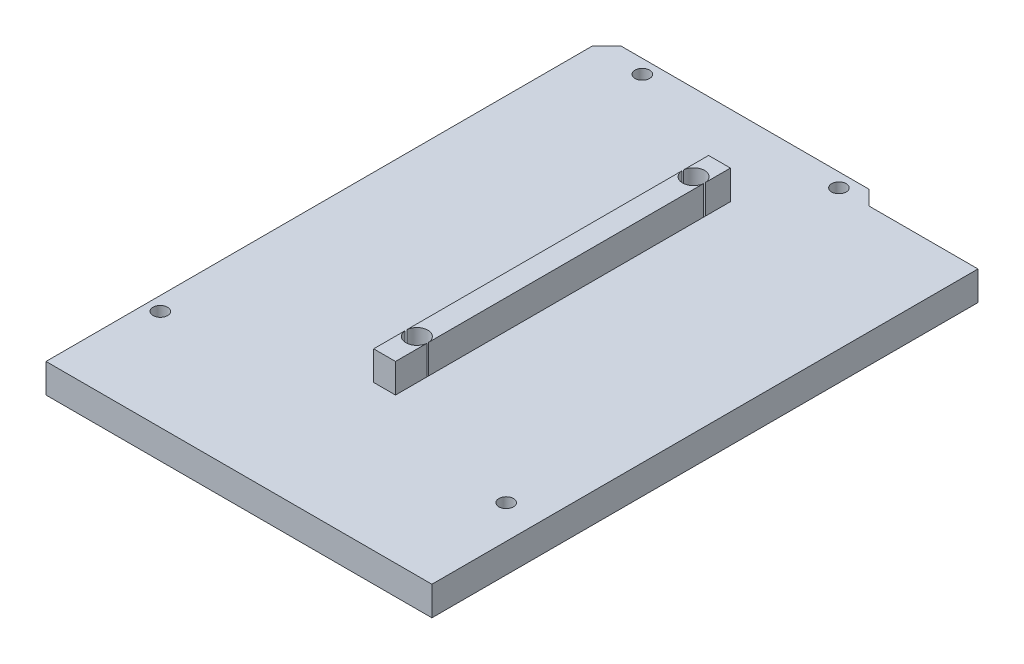
ISO-10303-21;
HEADER;
FILE_DESCRIPTION(('STEP AP214'),'2;1');
FILE_NAME('part.step','',(''),(''),'','','');
FILE_SCHEMA(('AUTOMOTIVE_DESIGN { 1 0 10303 214 1 1 1 1 }'));
ENDSEC;
DATA;
#1=APPLICATION_CONTEXT('core data for automotive mechanical design processes');
#2=APPLICATION_PROTOCOL_DEFINITION('international standard','automotive_design',2000,#1);
#3=PRODUCT_CONTEXT('',#1,'mechanical');
#4=PRODUCT('Part','Part','',(#3));
#5=PRODUCT_RELATED_PRODUCT_CATEGORY('part','',(#4));
#6=PRODUCT_DEFINITION_FORMATION('','',#4);
#7=PRODUCT_DEFINITION_CONTEXT('part definition',#1,'design');
#8=PRODUCT_DEFINITION('design','',#6,#7);
#9=PRODUCT_DEFINITION_SHAPE('','',#8);
#10=(LENGTH_UNIT() NAMED_UNIT(*) SI_UNIT(.MILLI.,.METRE.));
#11=(NAMED_UNIT(*) PLANE_ANGLE_UNIT() SI_UNIT($,.RADIAN.));
#12=(NAMED_UNIT(*) SI_UNIT($,.STERADIAN.) SOLID_ANGLE_UNIT());
#13=UNCERTAINTY_MEASURE_WITH_UNIT(LENGTH_MEASURE(1.E-05),#10,'distance_accuracy_value','');
#14=(GEOMETRIC_REPRESENTATION_CONTEXT(3) GLOBAL_UNCERTAINTY_ASSIGNED_CONTEXT((#13)) GLOBAL_UNIT_ASSIGNED_CONTEXT((#10,
#11,#12)) REPRESENTATION_CONTEXT('',''));
#15=CARTESIAN_POINT('',(0.,0.,0.));
#16=DIRECTION('',(0.,0.,1.));
#17=DIRECTION('',(1.,0.,0.));
#18=AXIS2_PLACEMENT_3D('',#15,#16,#17);
#19=CARTESIAN_POINT('',(25.3962608511216,8.,-65.8241962346628));
#20=DIRECTION('',(1.,0.,0.));
#21=DIRECTION('',(0.,0.,-1.));
#22=AXIS2_PLACEMENT_3D('',#19,#20,#21);
#23=PLANE('',#22);
#24=DIRECTION('',(0.,0.,1.));
#25=VECTOR('',#24,1.);
#26=CARTESIAN_POINT('',(25.3962608511216,8.,-65.8241962346628));
#27=LINE('',#26,#25);
#28=CARTESIAN_POINT('',(25.3962608511216,8.,-24.1403998808304));
#29=VERTEX_POINT('',#28);
#30=CARTESIAN_POINT('',(25.3962608511216,8.,-19.8241962346628));
#31=VERTEX_POINT('',#30);
#32=EDGE_CURVE('E261',#29,#31,#27,.T.);
#33=ORIENTED_EDGE('',*,*,#32,.F.);
#34=DIRECTION('',(0.,-1.,0.));
#35=VECTOR('',#34,1.);
#36=CARTESIAN_POINT('',(25.3962608511216,8.,-24.1403998808304));
#37=LINE('',#36,#35);
#38=CARTESIAN_POINT('',(25.3962608511216,4.,-24.1403998808304));
#39=VERTEX_POINT('',#38);
#40=EDGE_CURVE('E51',#29,#39,#37,.T.);
#41=ORIENTED_EDGE('',*,*,#40,.T.);
#42=DIRECTION('',(0.,0.,1.));
#43=VECTOR('',#42,1.);
#44=CARTESIAN_POINT('',(25.3962608511216,4.,-65.8241962346628));
#45=LINE('',#44,#43);
#46=CARTESIAN_POINT('',(25.3962608511216,4.,-19.8241962346628));
#47=VERTEX_POINT('',#46);
#48=EDGE_CURVE('E308',#39,#47,#45,.T.);
#49=ORIENTED_EDGE('',*,*,#48,.T.);
#50=DIRECTION('',(0.,-1.,0.));
#51=VECTOR('',#50,1.);
#52=CARTESIAN_POINT('',(25.3962608511216,8.,-19.8241962346628));
#53=LINE('',#52,#51);
#54=EDGE_CURVE('E392',#31,#47,#53,.T.);
#55=ORIENTED_EDGE('',*,*,#54,.F.);
#56=EDGE_LOOP('',(#33,#41,#49,#55));
#57=FACE_BOUND('',#56,.T.);
#58=ADVANCED_FACE('F35',(#57),#23,.F.);
#59=CARTESIAN_POINT('',(25.3962608511216,4.,-62.1403998808306));
#60=VERTEX_POINT('',#59);
#61=CARTESIAN_POINT('',(25.3962608511216,4.,-24.3855528942731));
#62=VERTEX_POINT('',#61);
#63=EDGE_CURVE('E275',#60,#62,#45,.T.);
#64=ORIENTED_EDGE('',*,*,#63,.T.);
#65=DIRECTION('',(0.,-1.,0.));
#66=VECTOR('',#65,1.);
#67=CARTESIAN_POINT('',(25.3962608511216,8.,-24.3855528942731));
#68=LINE('',#67,#66);
#69=CARTESIAN_POINT('',(25.3962608511216,8.,-24.3855528942731));
#70=VERTEX_POINT('',#69);
#71=EDGE_CURVE('E237',#62,#70,#68,.F.);
#72=ORIENTED_EDGE('',*,*,#71,.T.);
#73=CARTESIAN_POINT('',(25.3962608511216,8.,-62.1403998808306));
#74=VERTEX_POINT('',#73);
#75=EDGE_CURVE('E251',#74,#70,#27,.T.);
#76=ORIENTED_EDGE('',*,*,#75,.F.);
#77=DIRECTION('',(0.,-1.,0.));
#78=VECTOR('',#77,1.);
#79=CARTESIAN_POINT('',(25.3962608511216,8.,-62.1403998808306));
#80=LINE('',#79,#78);
#81=EDGE_CURVE('E59',#74,#60,#80,.T.);
#82=ORIENTED_EDGE('',*,*,#81,.T.);
#83=EDGE_LOOP('',(#64,#72,#76,#82));
#84=FACE_BOUND('',#83,.T.);
#85=ADVANCED_FACE('F360',(#84),#23,.F.);
#86=CARTESIAN_POINT('',(28.3962608511216,8.,-65.8241962346628));
#87=DIRECTION('',(-1.,0.,0.));
#88=DIRECTION('',(0.,0.,1.));
#89=AXIS2_PLACEMENT_3D('',#86,#87,#88);
#90=PLANE('',#89);
#91=DIRECTION('',(0.,0.,-1.));
#92=VECTOR('',#91,1.);
#93=CARTESIAN_POINT('',(28.3962608511216,8.,-65.8241962346628));
#94=LINE('',#93,#92);
#95=CARTESIAN_POINT('',(28.3962608511216,8.,-24.385552894273));
#96=VERTEX_POINT('',#95);
#97=CARTESIAN_POINT('',(28.3962608511216,8.,-62.1403998808304));
#98=VERTEX_POINT('',#97);
#99=EDGE_CURVE('E192',#96,#98,#94,.T.);
#100=ORIENTED_EDGE('',*,*,#99,.F.);
#101=DIRECTION('',(0.,-1.,0.));
#102=VECTOR('',#101,1.);
#103=CARTESIAN_POINT('',(28.3962608511216,8.,-24.385552894273));
#104=LINE('',#103,#102);
#105=CARTESIAN_POINT('',(28.3962608511216,4.,-24.385552894273));
#106=VERTEX_POINT('',#105);
#107=EDGE_CURVE('E234',#96,#106,#104,.T.);
#108=ORIENTED_EDGE('',*,*,#107,.T.);
#109=DIRECTION('',(0.,0.,-1.));
#110=VECTOR('',#109,1.);
#111=CARTESIAN_POINT('',(28.3962608511216,4.,-65.8241962346628));
#112=LINE('',#111,#110);
#113=CARTESIAN_POINT('',(28.3962608511216,4.,-62.1403998808303));
#114=VERTEX_POINT('',#113);
#115=EDGE_CURVE('E325',#106,#114,#112,.T.);
#116=ORIENTED_EDGE('',*,*,#115,.T.);
#117=DIRECTION('',(0.,-1.,0.));
#118=VECTOR('',#117,1.);
#119=CARTESIAN_POINT('',(28.3962608511216,8.,-62.1403998808303));
#120=LINE('',#119,#118);
#121=EDGE_CURVE('E231',#114,#98,#120,.F.);
#122=ORIENTED_EDGE('',*,*,#121,.T.);
#123=EDGE_LOOP('',(#100,#108,#116,#122));
#124=FACE_BOUND('',#123,.T.);
#125=ADVANCED_FACE('F330',(#124),#90,.F.);
#126=CARTESIAN_POINT('',(28.3962608511216,8.,-62.3855528942732));
#127=VERTEX_POINT('',#126);
#128=CARTESIAN_POINT('',(28.3962608511216,8.,-65.8241962346628));
#129=VERTEX_POINT('',#128);
#130=EDGE_CURVE('E181',#127,#129,#94,.T.);
#131=ORIENTED_EDGE('',*,*,#130,.F.);
#132=DIRECTION('',(0.,-1.,0.));
#133=VECTOR('',#132,1.);
#134=CARTESIAN_POINT('',(28.3962608511216,8.,-62.3855528942732));
#135=LINE('',#134,#133);
#136=CARTESIAN_POINT('',(28.3962608511216,4.,-62.3855528942732));
#137=VERTEX_POINT('',#136);
#138=EDGE_CURVE('E165',#127,#137,#135,.T.);
#139=ORIENTED_EDGE('',*,*,#138,.T.);
#140=CARTESIAN_POINT('',(28.3962608511216,4.,-65.8241962346628));
#141=VERTEX_POINT('',#140);
#142=EDGE_CURVE('E327',#137,#141,#112,.T.);
#143=ORIENTED_EDGE('',*,*,#142,.T.);
#144=DIRECTION('',(0.,-1.,0.));
#145=VECTOR('',#144,1.);
#146=CARTESIAN_POINT('',(28.3962608511216,8.,-65.8241962346628));
#147=LINE('',#146,#145);
#148=EDGE_CURVE('E190',#129,#141,#147,.T.);
#149=ORIENTED_EDGE('',*,*,#148,.F.);
#150=EDGE_LOOP('',(#131,#139,#143,#149));
#151=FACE_BOUND('',#150,.T.);
#152=ADVANCED_FACE('F188',(#151),#90,.F.);
#153=CARTESIAN_POINT('',(0.,8.,0.));
#154=DIRECTION('',(0.,1.,0.));
#155=DIRECTION('',(0.,0.,1.));
#156=AXIS2_PLACEMENT_3D('',#153,#154,#155);
#157=PLANE('',#156);
#158=CARTESIAN_POINT('',(26.8962608511216,8.,-24.2629763875518));
#159=DIRECTION('',(0.,1.,0.));
#160=DIRECTION('',(0.,0.,1.));
#161=AXIS2_PLACEMENT_3D('',#158,#159,#160);
#162=CIRCLE('',#161,1.505);
#163=EDGE_CURVE('E217',#96,#70,#162,.T.);
#164=ORIENTED_EDGE('',*,*,#163,.F.);
#165=ORIENTED_EDGE('',*,*,#99,.T.);
#166=CARTESIAN_POINT('',(26.8962608511216,8.,-62.2629763875518));
#167=DIRECTION('',(0.,1.,0.));
#168=DIRECTION('',(0.,0.,1.));
#169=AXIS2_PLACEMENT_3D('',#166,#167,#168);
#170=CIRCLE('',#169,1.505);
#171=EDGE_CURVE('E186',#74,#98,#170,.T.);
#172=ORIENTED_EDGE('',*,*,#171,.F.);
#173=ORIENTED_EDGE('',*,*,#75,.T.);
#174=EDGE_LOOP('',(#164,#165,#172,#173));
#175=FACE_BOUND('',#174,.T.);
#176=ADVANCED_FACE('F476',(#175),#157,.T.);
#177=CARTESIAN_POINT('',(25.3962608511216,8.,-62.385552894273));
#178=VERTEX_POINT('',#177);
#179=EDGE_CURVE('E168',#127,#178,#170,.T.);
#180=ORIENTED_EDGE('',*,*,#179,.F.);
#181=ORIENTED_EDGE('',*,*,#130,.T.);
#182=DIRECTION('',(-1.,0.,0.));
#183=VECTOR('',#182,1.);
#184=CARTESIAN_POINT('',(25.3962608511216,8.,-65.8241962346628));
#185=LINE('',#184,#183);
#186=CARTESIAN_POINT('',(25.3962608511216,8.,-65.8241962346628));
#187=VERTEX_POINT('',#186);
#188=EDGE_CURVE('E207',#129,#187,#185,.T.);
#189=ORIENTED_EDGE('',*,*,#188,.T.);
#190=EDGE_CURVE('E184',#187,#178,#27,.T.);
#191=ORIENTED_EDGE('',*,*,#190,.T.);
#192=EDGE_LOOP('',(#180,#181,#189,#191));
#193=FACE_BOUND('',#192,.T.);
#194=ADVANCED_FACE('F180',(#193),#157,.T.);
#195=CARTESIAN_POINT('',(0.,4.,0.));
#196=DIRECTION('',(0.,-1.,0.));
#197=DIRECTION('',(0.,0.,-1.));
#198=AXIS2_PLACEMENT_3D('',#195,#196,#197);
#199=PLANE('',#198);
#200=CARTESIAN_POINT('',(48.7962608511216,4.,-14.6241962346628));
#201=DIRECTION('',(0.,1.,0.));
#202=DIRECTION('',(0.,0.,1.));
#203=AXIS2_PLACEMENT_3D('',#200,#201,#202);
#204=CIRCLE('',#203,0.999999999999998);
#205=CARTESIAN_POINT('',(48.7962608511216,4.,-13.6241962346628));
#206=VERTEX_POINT('',#205);
#207=EDGE_CURVE('E398',#206,#206,#204,.T.);
#208=ORIENTED_EDGE('',*,*,#207,.F.);
#209=EDGE_LOOP('',(#208));
#210=FACE_BOUND('',#209,.T.);
#211=CARTESIAN_POINT('',(2.29626085112156,4.,-13.6241962346628));
#212=DIRECTION('',(0.,1.,0.));
#213=DIRECTION('',(0.,0.,1.));
#214=AXIS2_PLACEMENT_3D('',#211,#212,#213);
#215=CIRCLE('',#214,1.);
#216=CARTESIAN_POINT('',(2.29626085112156,4.,-12.6241962346628));
#217=VERTEX_POINT('',#216);
#218=EDGE_CURVE('E404',#217,#217,#215,.T.);
#219=ORIENTED_EDGE('',*,*,#218,.F.);
#220=EDGE_LOOP('',(#219));
#221=FACE_BOUND('',#220,.T.);
#222=CARTESIAN_POINT('',(34.1962608511216,4.,-74.9241962346628));
#223=DIRECTION('',(0.,1.,0.));
#224=DIRECTION('',(0.,0.,1.));
#225=AXIS2_PLACEMENT_3D('',#222,#223,#224);
#226=CIRCLE('',#225,0.999999999999998);
#227=CARTESIAN_POINT('',(34.1962608511216,4.,-73.9241962346628));
#228=VERTEX_POINT('',#227);
#229=EDGE_CURVE('E410',#228,#228,#226,.T.);
#230=ORIENTED_EDGE('',*,*,#229,.F.);
#231=EDGE_LOOP('',(#230));
#232=FACE_BOUND('',#231,.T.);
#233=CARTESIAN_POINT('',(7.19626085112156,4.,-74.9241962346628));
#234=DIRECTION('',(0.,1.,0.));
#235=DIRECTION('',(0.,0.,1.));
#236=AXIS2_PLACEMENT_3D('',#233,#234,#235);
#237=CIRCLE('',#236,1.);
#238=CARTESIAN_POINT('',(7.19626085112156,4.,-73.9241962346628));
#239=VERTEX_POINT('',#238);
#240=EDGE_CURVE('E416',#239,#239,#237,.T.);
#241=ORIENTED_EDGE('',*,*,#240,.F.);
#242=EDGE_LOOP('',(#241));
#243=FACE_BOUND('',#242,.T.);
#244=DIRECTION('',(-0.707106781186546,0.,0.707106781186549));
#245=VECTOR('',#244,1.);
#246=CARTESIAN_POINT('',(0.396260851121559,4.,-74.8241962346628));
#247=LINE('',#246,#245);
#248=CARTESIAN_POINT('',(2.39626085112151,4.,-76.8241962346628));
#249=VERTEX_POINT('',#248);
#250=CARTESIAN_POINT('',(0.396260851121559,4.,-74.8241962346628));
#251=VERTEX_POINT('',#250);
#252=EDGE_CURVE('E422',#249,#251,#247,.T.);
#253=ORIENTED_EDGE('',*,*,#252,.T.);
#254=DIRECTION('',(0.,0.,1.));
#255=VECTOR('',#254,1.);
#256=CARTESIAN_POINT('',(0.396260851121558,4.,0.175803765337247));
#257=LINE('',#256,#255);
#258=CARTESIAN_POINT('',(0.396260851121558,4.,0.175803765337247));
#259=VERTEX_POINT('',#258);
#260=EDGE_CURVE('E425',#251,#259,#257,.T.);
#261=ORIENTED_EDGE('',*,*,#260,.T.);
#262=DIRECTION('',(1.,0.,0.));
#263=VECTOR('',#262,1.);
#264=CARTESIAN_POINT('',(53.3962608511216,4.,0.17580376533724));
#265=LINE('',#264,#263);
#266=CARTESIAN_POINT('',(53.3962608511216,4.,0.17580376533724));
#267=VERTEX_POINT('',#266);
#268=EDGE_CURVE('E428',#259,#267,#265,.T.);
#269=ORIENTED_EDGE('',*,*,#268,.T.);
#270=DIRECTION('',(0.,0.,-1.));
#271=VECTOR('',#270,1.);
#272=CARTESIAN_POINT('',(53.3962608511216,4.,-74.8241962346628));
#273=LINE('',#272,#271);
#274=CARTESIAN_POINT('',(53.3962608511216,4.,-74.8241962346628));
#275=VERTEX_POINT('',#274);
#276=EDGE_CURVE('E430',#267,#275,#273,.T.);
#277=ORIENTED_EDGE('',*,*,#276,.T.);
#278=DIRECTION('',(-1.,0.,0.));
#279=VECTOR('',#278,1.);
#280=CARTESIAN_POINT('',(38.3962608511218,4.,-74.8241962346628));
#281=LINE('',#280,#279);
#282=CARTESIAN_POINT('',(38.3962608511218,4.,-74.8241962346628));
#283=VERTEX_POINT('',#282);
#284=EDGE_CURVE('E432',#275,#283,#281,.T.);
#285=ORIENTED_EDGE('',*,*,#284,.T.);
#286=DIRECTION('',(-0.707106781186549,0.,-0.707106781186546));
#287=VECTOR('',#286,1.);
#288=CARTESIAN_POINT('',(36.3962608511217,4.,-76.8241962346628));
#289=LINE('',#288,#287);
#290=CARTESIAN_POINT('',(36.3962608511217,4.,-76.8241962346628));
#291=VERTEX_POINT('',#290);
#292=EDGE_CURVE('E434',#283,#291,#289,.T.);
#293=ORIENTED_EDGE('',*,*,#292,.T.);
#294=DIRECTION('',(-1.,0.,0.));
#295=VECTOR('',#294,1.);
#296=CARTESIAN_POINT('',(2.39626085112151,4.,-76.8241962346628));
#297=LINE('',#296,#295);
#298=EDGE_CURVE('E436',#291,#249,#297,.T.);
#299=ORIENTED_EDGE('',*,*,#298,.T.);
#300=EDGE_LOOP('',(#253,#261,#269,#277,#285,#293,#299));
#301=FACE_BOUND('',#300,.T.);
#302=ORIENTED_EDGE('',*,*,#115,.F.);
#303=CARTESIAN_POINT('',(28.3962608511216,4.,-24.385552894273));
#304=CARTESIAN_POINT('',(28.4062775177882,4.,-24.2629763875518));
#305=CARTESIAN_POINT('',(28.3962608511216,4.,-24.1403998808305));
#306=B_SPLINE_CURVE_WITH_KNOTS('',2,(#303,#304,#305),.UNSPECIFIED.,.F.,.F.,(3,3),(0.,1.),.UNSPECIFIED.);
#307=CARTESIAN_POINT('',(28.3962608511216,4.,-24.1403998808305));
#308=VERTEX_POINT('',#307);
#309=EDGE_CURVE('E238',#106,#308,#306,.T.);
#310=ORIENTED_EDGE('',*,*,#309,.T.);
#311=CARTESIAN_POINT('',(28.3962608511216,4.,-19.8241962346628));
#312=VERTEX_POINT('',#311);
#313=EDGE_CURVE('E331',#312,#308,#112,.T.);
#314=ORIENTED_EDGE('',*,*,#313,.F.);
#315=DIRECTION('',(1.,0.,0.));
#316=VECTOR('',#315,1.);
#317=CARTESIAN_POINT('',(25.3962608511216,4.,-19.8241962346628));
#318=LINE('',#317,#316);
#319=EDGE_CURVE('E318',#47,#312,#318,.T.);
#320=ORIENTED_EDGE('',*,*,#319,.F.);
#321=ORIENTED_EDGE('',*,*,#48,.F.);
#322=CARTESIAN_POINT('',(25.3962608511216,4.,-24.1403998808304));
#323=CARTESIAN_POINT('',(25.3862441844549,4.,-24.2629763875518));
#324=CARTESIAN_POINT('',(25.3962608511216,4.,-24.3855528942731));
#325=B_SPLINE_CURVE_WITH_KNOTS('',2,(#322,#323,#324),.UNSPECIFIED.,.F.,.F.,(3,3),(0.,1.),.UNSPECIFIED.);
#326=EDGE_CURVE('E479',#39,#62,#325,.T.);
#327=ORIENTED_EDGE('',*,*,#326,.T.);
#328=ORIENTED_EDGE('',*,*,#63,.F.);
#329=CARTESIAN_POINT('',(25.3962608511216,4.,-62.1403998808306));
#330=CARTESIAN_POINT('',(25.3862441844549,4.,-62.2629763875518));
#331=CARTESIAN_POINT('',(25.3962608511216,4.,-62.385552894273));
#332=B_SPLINE_CURVE_WITH_KNOTS('',2,(#329,#330,#331),.UNSPECIFIED.,.F.,.F.,(3,3),(0.,1.),.UNSPECIFIED.);
#333=CARTESIAN_POINT('',(25.3962608511216,4.,-62.385552894273));
#334=VERTEX_POINT('',#333);
#335=EDGE_CURVE('E244',#60,#334,#332,.T.);
#336=ORIENTED_EDGE('',*,*,#335,.T.);
#337=CARTESIAN_POINT('',(25.3962608511216,4.,-65.8241962346628));
#338=VERTEX_POINT('',#337);
#339=EDGE_CURVE('E322',#338,#334,#45,.T.);
#340=ORIENTED_EDGE('',*,*,#339,.F.);
#341=DIRECTION('',(-1.,0.,0.));
#342=VECTOR('',#341,1.);
#343=CARTESIAN_POINT('',(25.3962608511216,4.,-65.8241962346628));
#344=LINE('',#343,#342);
#345=EDGE_CURVE('E264',#141,#338,#344,.T.);
#346=ORIENTED_EDGE('',*,*,#345,.F.);
#347=ORIENTED_EDGE('',*,*,#142,.F.);
#348=CARTESIAN_POINT('',(28.3962608511216,4.,-62.3855528942732));
#349=CARTESIAN_POINT('',(28.4062775177882,4.,-62.2629763875518));
#350=CARTESIAN_POINT('',(28.3962608511216,4.,-62.1403998808303));
#351=B_SPLINE_CURVE_WITH_KNOTS('',2,(#348,#349,#350),.UNSPECIFIED.,.F.,.F.,(3,3),(0.,1.),.UNSPECIFIED.);
#352=EDGE_CURVE('E171',#137,#114,#351,.T.);
#353=ORIENTED_EDGE('',*,*,#352,.T.);
#354=EDGE_LOOP('',(#302,#310,#314,#320,#321,#327,#328,#336,#340,#346,#347,#353));
#355=FACE_BOUND('',#354,.T.);
#356=ADVANCED_FACE('F277',(#210,#221,#232,#243,#301,#355),#199,.F.);
#357=CARTESIAN_POINT('',(0.,0.,0.));
#358=DIRECTION('',(0.,-1.,0.));
#359=DIRECTION('',(0.,0.,-1.));
#360=AXIS2_PLACEMENT_3D('',#357,#358,#359);
#361=PLANE('',#360);
#362=CARTESIAN_POINT('',(26.8962608511216,0.,-24.2629763875518));
#363=DIRECTION('',(0.,-1.,0.));
#364=DIRECTION('',(0.,0.,-1.));
#365=AXIS2_PLACEMENT_3D('',#362,#363,#364);
#366=CIRCLE('',#365,3.00499999999999);
#367=CARTESIAN_POINT('',(26.8962608511216,0.,-27.2679763875518));
#368=VERTEX_POINT('',#367);
#369=EDGE_CURVE('E11',#368,#368,#366,.F.);
#370=ORIENTED_EDGE('',*,*,#369,.T.);
#371=EDGE_LOOP('',(#370));
#372=FACE_BOUND('',#371,.T.);
#373=CARTESIAN_POINT('',(26.8962608511216,0.,-62.2629763875518));
#374=DIRECTION('',(0.,-1.,0.));
#375=DIRECTION('',(0.,0.,-1.));
#376=AXIS2_PLACEMENT_3D('',#373,#374,#375);
#377=CIRCLE('',#376,3.00499999999999);
#378=CARTESIAN_POINT('',(26.8962608511216,0.,-65.2679763875518));
#379=VERTEX_POINT('',#378);
#380=EDGE_CURVE('E344',#379,#379,#377,.F.);
#381=ORIENTED_EDGE('',*,*,#380,.T.);
#382=EDGE_LOOP('',(#381));
#383=FACE_BOUND('',#382,.T.);
#384=CARTESIAN_POINT('',(2.29626085112156,0.,-13.6241962346628));
#385=DIRECTION('',(0.,1.,0.));
#386=DIRECTION('',(0.,0.,1.));
#387=AXIS2_PLACEMENT_3D('',#384,#385,#386);
#388=CIRCLE('',#387,1.);
#389=CARTESIAN_POINT('',(2.29626085112156,0.,-12.6241962346628));
#390=VERTEX_POINT('',#389);
#391=EDGE_CURVE('E401',#390,#390,#388,.T.);
#392=ORIENTED_EDGE('',*,*,#391,.T.);
#393=EDGE_LOOP('',(#392));
#394=FACE_BOUND('',#393,.T.);
#395=CARTESIAN_POINT('',(7.19626085112156,0.,-74.9241962346628));
#396=DIRECTION('',(0.,1.,0.));
#397=DIRECTION('',(0.,0.,1.));
#398=AXIS2_PLACEMENT_3D('',#395,#396,#397);
#399=CIRCLE('',#398,1.);
#400=CARTESIAN_POINT('',(7.19626085112156,0.,-73.9241962346628));
#401=VERTEX_POINT('',#400);
#402=EDGE_CURVE('E413',#401,#401,#399,.T.);
#403=ORIENTED_EDGE('',*,*,#402,.T.);
#404=EDGE_LOOP('',(#403));
#405=FACE_BOUND('',#404,.T.);
#406=DIRECTION('',(-0.707106781186546,0.,0.707106781186549));
#407=VECTOR('',#406,1.);
#408=CARTESIAN_POINT('',(0.396260851121559,0.,-74.8241962346628));
#409=LINE('',#408,#407);
#410=CARTESIAN_POINT('',(2.39626085112151,0.,-76.8241962346628));
#411=VERTEX_POINT('',#410);
#412=CARTESIAN_POINT('',(0.396260851121559,0.,-74.8241962346628));
#413=VERTEX_POINT('',#412);
#414=EDGE_CURVE('E419',#411,#413,#409,.T.);
#415=ORIENTED_EDGE('',*,*,#414,.F.);
#416=DIRECTION('',(-1.,0.,0.));
#417=VECTOR('',#416,1.);
#418=CARTESIAN_POINT('',(2.39626085112151,0.,-76.8241962346628));
#419=LINE('',#418,#417);
#420=CARTESIAN_POINT('',(36.3962608511217,0.,-76.8241962346628));
#421=VERTEX_POINT('',#420);
#422=EDGE_CURVE('E426',#421,#411,#419,.T.);
#423=ORIENTED_EDGE('',*,*,#422,.F.);
#424=DIRECTION('',(-0.707106781186549,0.,-0.707106781186546));
#425=VECTOR('',#424,1.);
#426=CARTESIAN_POINT('',(36.3962608511217,0.,-76.8241962346628));
#427=LINE('',#426,#425);
#428=CARTESIAN_POINT('',(38.3962608511218,0.,-74.8241962346628));
#429=VERTEX_POINT('',#428);
#430=EDGE_CURVE('E449',#429,#421,#427,.T.);
#431=ORIENTED_EDGE('',*,*,#430,.F.);
#432=DIRECTION('',(-1.,0.,0.));
#433=VECTOR('',#432,1.);
#434=CARTESIAN_POINT('',(38.3962608511218,0.,-74.8241962346628));
#435=LINE('',#434,#433);
#436=CARTESIAN_POINT('',(53.3962608511216,0.,-74.8241962346628));
#437=VERTEX_POINT('',#436);
#438=EDGE_CURVE('E447',#437,#429,#435,.T.);
#439=ORIENTED_EDGE('',*,*,#438,.F.);
#440=DIRECTION('',(0.,0.,-1.));
#441=VECTOR('',#440,1.);
#442=CARTESIAN_POINT('',(53.3962608511216,0.,-74.8241962346628));
#443=LINE('',#442,#441);
#444=CARTESIAN_POINT('',(53.3962608511216,0.,0.17580376533724));
#445=VERTEX_POINT('',#444);
#446=EDGE_CURVE('E445',#445,#437,#443,.T.);
#447=ORIENTED_EDGE('',*,*,#446,.F.);
#448=DIRECTION('',(1.,0.,0.));
#449=VECTOR('',#448,1.);
#450=CARTESIAN_POINT('',(53.3962608511216,0.,0.17580376533724));
#451=LINE('',#450,#449);
#452=CARTESIAN_POINT('',(0.396260851121558,0.,0.175803765337247));
#453=VERTEX_POINT('',#452);
#454=EDGE_CURVE('E443',#453,#445,#451,.T.);
#455=ORIENTED_EDGE('',*,*,#454,.F.);
#456=DIRECTION('',(0.,0.,1.));
#457=VECTOR('',#456,1.);
#458=CARTESIAN_POINT('',(0.396260851121558,0.,0.175803765337247));
#459=LINE('',#458,#457);
#460=EDGE_CURVE('E441',#413,#453,#459,.T.);
#461=ORIENTED_EDGE('',*,*,#460,.F.);
#462=EDGE_LOOP('',(#415,#423,#431,#439,#447,#455,#461));
#463=FACE_BOUND('',#462,.T.);
#464=CARTESIAN_POINT('',(34.1962608511216,0.,-74.9241962346628));
#465=DIRECTION('',(0.,1.,0.));
#466=DIRECTION('',(0.,0.,1.));
#467=AXIS2_PLACEMENT_3D('',#464,#465,#466);
#468=CIRCLE('',#467,0.999999999999998);
#469=CARTESIAN_POINT('',(34.1962608511216,0.,-73.9241962346628));
#470=VERTEX_POINT('',#469);
#471=EDGE_CURVE('E407',#470,#470,#468,.T.);
#472=ORIENTED_EDGE('',*,*,#471,.T.);
#473=EDGE_LOOP('',(#472));
#474=FACE_BOUND('',#473,.T.);
#475=CARTESIAN_POINT('',(48.7962608511216,0.,-14.6241962346628));
#476=DIRECTION('',(0.,1.,0.));
#477=DIRECTION('',(0.,0.,1.));
#478=AXIS2_PLACEMENT_3D('',#475,#476,#477);
#479=CIRCLE('',#478,0.999999999999998);
#480=CARTESIAN_POINT('',(48.7962608511216,0.,-13.6241962346628));
#481=VERTEX_POINT('',#480);
#482=EDGE_CURVE('E397',#481,#481,#479,.T.);
#483=ORIENTED_EDGE('',*,*,#482,.T.);
#484=EDGE_LOOP('',(#483));
#485=FACE_BOUND('',#484,.T.);
#486=ADVANCED_FACE('F287',(#372,#383,#394,#405,#463,#474,#485),#361,.T.);
#487=CARTESIAN_POINT('',(0.396260851121559,4.,-74.8241962346628));
#488=DIRECTION('',(0.707106781186549,0.,0.707106781186546));
#489=DIRECTION('',(0.707106781186546,0.,-0.707106781186549));
#490=AXIS2_PLACEMENT_3D('',#487,#488,#489);
#491=PLANE('',#490);
#492=ORIENTED_EDGE('',*,*,#414,.T.);
#493=DIRECTION('',(0.,-1.,0.));
#494=VECTOR('',#493,1.);
#495=CARTESIAN_POINT('',(0.396260851121559,4.,-74.8241962346628));
#496=LINE('',#495,#494);
#497=EDGE_CURVE('E468',#251,#413,#496,.T.);
#498=ORIENTED_EDGE('',*,*,#497,.F.);
#499=ORIENTED_EDGE('',*,*,#252,.F.);
#500=DIRECTION('',(0.,-1.,0.));
#501=VECTOR('',#500,1.);
#502=CARTESIAN_POINT('',(2.39626085112151,4.,-76.8241962346628));
#503=LINE('',#502,#501);
#504=EDGE_CURVE('E438',#249,#411,#503,.T.);
#505=ORIENTED_EDGE('',*,*,#504,.T.);
#506=EDGE_LOOP('',(#492,#498,#499,#505));
#507=FACE_BOUND('',#506,.T.);
#508=ADVANCED_FACE('F545',(#507),#491,.F.);
#509=CARTESIAN_POINT('',(0.396260851121558,4.,0.175803765337247));
#510=DIRECTION('',(1.,0.,0.));
#511=DIRECTION('',(0.,0.,-1.));
#512=AXIS2_PLACEMENT_3D('',#509,#510,#511);
#513=PLANE('',#512);
#514=ORIENTED_EDGE('',*,*,#460,.T.);
#515=DIRECTION('',(0.,-1.,0.));
#516=VECTOR('',#515,1.);
#517=CARTESIAN_POINT('',(0.396260851121558,4.,0.175803765337247));
#518=LINE('',#517,#516);
#519=EDGE_CURVE('E466',#259,#453,#518,.T.);
#520=ORIENTED_EDGE('',*,*,#519,.F.);
#521=ORIENTED_EDGE('',*,*,#260,.F.);
#522=ORIENTED_EDGE('',*,*,#497,.T.);
#523=EDGE_LOOP('',(#514,#520,#521,#522));
#524=FACE_BOUND('',#523,.T.);
#525=ADVANCED_FACE('F554',(#524),#513,.F.);
#526=CARTESIAN_POINT('',(53.3962608511216,4.,0.17580376533724));
#527=DIRECTION('',(0.,0.,-1.));
#528=DIRECTION('',(-1.,0.,0.));
#529=AXIS2_PLACEMENT_3D('',#526,#527,#528);
#530=PLANE('',#529);
#531=ORIENTED_EDGE('',*,*,#454,.T.);
#532=DIRECTION('',(0.,-1.,0.));
#533=VECTOR('',#532,1.);
#534=CARTESIAN_POINT('',(53.3962608511216,4.,0.17580376533724));
#535=LINE('',#534,#533);
#536=EDGE_CURVE('E463',#267,#445,#535,.T.);
#537=ORIENTED_EDGE('',*,*,#536,.F.);
#538=ORIENTED_EDGE('',*,*,#268,.F.);
#539=ORIENTED_EDGE('',*,*,#519,.T.);
#540=EDGE_LOOP('',(#531,#537,#538,#539));
#541=FACE_BOUND('',#540,.T.);
#542=ADVANCED_FACE('F562',(#541),#530,.F.);
#543=CARTESIAN_POINT('',(53.3962608511216,4.,-74.8241962346628));
#544=DIRECTION('',(-1.,0.,0.));
#545=DIRECTION('',(0.,0.,1.));
#546=AXIS2_PLACEMENT_3D('',#543,#544,#545);
#547=PLANE('',#546);
#548=ORIENTED_EDGE('',*,*,#446,.T.);
#549=DIRECTION('',(0.,-1.,0.));
#550=VECTOR('',#549,1.);
#551=CARTESIAN_POINT('',(53.3962608511216,4.,-74.8241962346628));
#552=LINE('',#551,#550);
#553=EDGE_CURVE('E460',#275,#437,#552,.T.);
#554=ORIENTED_EDGE('',*,*,#553,.F.);
#555=ORIENTED_EDGE('',*,*,#276,.F.);
#556=ORIENTED_EDGE('',*,*,#536,.T.);
#557=EDGE_LOOP('',(#548,#554,#555,#556));
#558=FACE_BOUND('',#557,.T.);
#559=ADVANCED_FACE('F569',(#558),#547,.F.);
#560=CARTESIAN_POINT('',(38.3962608511218,4.,-74.8241962346628));
#561=DIRECTION('',(0.,0.,1.));
#562=DIRECTION('',(1.,0.,0.));
#563=AXIS2_PLACEMENT_3D('',#560,#561,#562);
#564=PLANE('',#563);
#565=ORIENTED_EDGE('',*,*,#438,.T.);
#566=DIRECTION('',(0.,-1.,0.));
#567=VECTOR('',#566,1.);
#568=CARTESIAN_POINT('',(38.3962608511218,4.,-74.8241962346628));
#569=LINE('',#568,#567);
#570=EDGE_CURVE('E457',#283,#429,#569,.T.);
#571=ORIENTED_EDGE('',*,*,#570,.F.);
#572=ORIENTED_EDGE('',*,*,#284,.F.);
#573=ORIENTED_EDGE('',*,*,#553,.T.);
#574=EDGE_LOOP('',(#565,#571,#572,#573));
#575=FACE_BOUND('',#574,.T.);
#576=ADVANCED_FACE('F577',(#575),#564,.F.);
#577=CARTESIAN_POINT('',(36.3962608511217,4.,-76.8241962346628));
#578=DIRECTION('',(-0.707106781186546,0.,0.707106781186549));
#579=DIRECTION('',(0.707106781186549,0.,0.707106781186546));
#580=AXIS2_PLACEMENT_3D('',#577,#578,#579);
#581=PLANE('',#580);
#582=ORIENTED_EDGE('',*,*,#430,.T.);
#583=DIRECTION('',(0.,-1.,0.));
#584=VECTOR('',#583,1.);
#585=CARTESIAN_POINT('',(36.3962608511217,4.,-76.8241962346628));
#586=LINE('',#585,#584);
#587=EDGE_CURVE('E454',#291,#421,#586,.T.);
#588=ORIENTED_EDGE('',*,*,#587,.F.);
#589=ORIENTED_EDGE('',*,*,#292,.F.);
#590=ORIENTED_EDGE('',*,*,#570,.T.);
#591=EDGE_LOOP('',(#582,#588,#589,#590));
#592=FACE_BOUND('',#591,.T.);
#593=ADVANCED_FACE('F585',(#592),#581,.F.);
#594=CARTESIAN_POINT('',(2.39626085112151,4.,-76.8241962346628));
#595=DIRECTION('',(0.,0.,1.));
#596=DIRECTION('',(1.,0.,0.));
#597=AXIS2_PLACEMENT_3D('',#594,#595,#596);
#598=PLANE('',#597);
#599=ORIENTED_EDGE('',*,*,#422,.T.);
#600=ORIENTED_EDGE('',*,*,#504,.F.);
#601=ORIENTED_EDGE('',*,*,#298,.F.);
#602=ORIENTED_EDGE('',*,*,#587,.T.);
#603=EDGE_LOOP('',(#599,#600,#601,#602));
#604=FACE_BOUND('',#603,.T.);
#605=ADVANCED_FACE('F593',(#604),#598,.F.);
#606=CARTESIAN_POINT('',(7.19626085112156,4.,-74.9241962346628));
#607=DIRECTION('',(0.,-1.,0.));
#608=DIRECTION('',(0.,0.,-1.));
#609=AXIS2_PLACEMENT_3D('',#606,#607,#608);
#610=CYLINDRICAL_SURFACE('',#609,1.);
#611=ORIENTED_EDGE('',*,*,#240,.T.);
#612=EDGE_LOOP('',(#611));
#613=FACE_BOUND('',#612,.T.);
#614=ORIENTED_EDGE('',*,*,#402,.F.);
#615=EDGE_LOOP('',(#614));
#616=FACE_BOUND('',#615,.T.);
#617=ADVANCED_FACE('F289',(#613,#616),#610,.F.);
#618=CARTESIAN_POINT('',(34.1962608511216,4.,-74.9241962346628));
#619=DIRECTION('',(0.,-1.,0.));
#620=DIRECTION('',(0.,0.,-1.));
#621=AXIS2_PLACEMENT_3D('',#618,#619,#620);
#622=CYLINDRICAL_SURFACE('',#621,0.999999999999998);
#623=ORIENTED_EDGE('',*,*,#229,.T.);
#624=EDGE_LOOP('',(#623));
#625=FACE_BOUND('',#624,.T.);
#626=ORIENTED_EDGE('',*,*,#471,.F.);
#627=EDGE_LOOP('',(#626));
#628=FACE_BOUND('',#627,.T.);
#629=ADVANCED_FACE('F607',(#625,#628),#622,.F.);
#630=CARTESIAN_POINT('',(2.29626085112156,4.,-13.6241962346628));
#631=DIRECTION('',(0.,-1.,0.));
#632=DIRECTION('',(0.,0.,-1.));
#633=AXIS2_PLACEMENT_3D('',#630,#631,#632);
#634=CYLINDRICAL_SURFACE('',#633,1.);
#635=ORIENTED_EDGE('',*,*,#218,.T.);
#636=EDGE_LOOP('',(#635));
#637=FACE_BOUND('',#636,.T.);
#638=ORIENTED_EDGE('',*,*,#391,.F.);
#639=EDGE_LOOP('',(#638));
#640=FACE_BOUND('',#639,.T.);
#641=ADVANCED_FACE('F381',(#637,#640),#634,.F.);
#642=CARTESIAN_POINT('',(48.7962608511216,4.,-14.6241962346628));
#643=DIRECTION('',(0.,-1.,0.));
#644=DIRECTION('',(0.,0.,-1.));
#645=AXIS2_PLACEMENT_3D('',#642,#643,#644);
#646=CYLINDRICAL_SURFACE('',#645,0.999999999999998);
#647=ORIENTED_EDGE('',*,*,#207,.T.);
#648=EDGE_LOOP('',(#647));
#649=FACE_BOUND('',#648,.T.);
#650=ORIENTED_EDGE('',*,*,#482,.F.);
#651=EDGE_LOOP('',(#650));
#652=FACE_BOUND('',#651,.T.);
#653=ADVANCED_FACE('F373',(#649,#652),#646,.F.);
#654=ORIENTED_EDGE('',*,*,#339,.T.);
#655=DIRECTION('',(0.,-1.,0.));
#656=VECTOR('',#655,1.);
#657=CARTESIAN_POINT('',(25.3962608511216,8.,-62.385552894273));
#658=LINE('',#657,#656);
#659=EDGE_CURVE('E176',#334,#178,#658,.F.);
#660=ORIENTED_EDGE('',*,*,#659,.T.);
#661=ORIENTED_EDGE('',*,*,#190,.F.);
#662=DIRECTION('',(0.,-1.,0.));
#663=VECTOR('',#662,1.);
#664=CARTESIAN_POINT('',(25.3962608511216,8.,-65.8241962346628));
#665=LINE('',#664,#663);
#666=EDGE_CURVE('E385',#187,#338,#665,.T.);
#667=ORIENTED_EDGE('',*,*,#666,.T.);
#668=EDGE_LOOP('',(#654,#660,#661,#667));
#669=FACE_BOUND('',#668,.T.);
#670=ADVANCED_FACE('F363',(#669),#23,.F.);
#671=CARTESIAN_POINT('',(25.3962608511216,8.,-19.8241962346628));
#672=DIRECTION('',(0.,0.,-1.));
#673=DIRECTION('',(-1.,0.,0.));
#674=AXIS2_PLACEMENT_3D('',#671,#672,#673);
#675=PLANE('',#674);
#676=ORIENTED_EDGE('',*,*,#319,.T.);
#677=DIRECTION('',(0.,-1.,0.));
#678=VECTOR('',#677,1.);
#679=CARTESIAN_POINT('',(28.3962608511216,8.,-19.8241962346628));
#680=LINE('',#679,#678);
#681=CARTESIAN_POINT('',(28.3962608511216,8.,-19.8241962346628));
#682=VERTEX_POINT('',#681);
#683=EDGE_CURVE('E389',#682,#312,#680,.T.);
#684=ORIENTED_EDGE('',*,*,#683,.F.);
#685=DIRECTION('',(1.,0.,0.));
#686=VECTOR('',#685,1.);
#687=CARTESIAN_POINT('',(25.3962608511216,8.,-19.8241962346628));
#688=LINE('',#687,#686);
#689=EDGE_CURVE('E193',#31,#682,#688,.T.);
#690=ORIENTED_EDGE('',*,*,#689,.F.);
#691=ORIENTED_EDGE('',*,*,#54,.T.);
#692=EDGE_LOOP('',(#676,#684,#690,#691));
#693=FACE_BOUND('',#692,.T.);
#694=ADVANCED_FACE('F372',(#693),#675,.F.);
#695=ORIENTED_EDGE('',*,*,#313,.T.);
#696=DIRECTION('',(0.,-1.,0.));
#697=VECTOR('',#696,1.);
#698=CARTESIAN_POINT('',(28.3962608511216,8.,-24.1403998808305));
#699=LINE('',#698,#697);
#700=CARTESIAN_POINT('',(28.3962608511216,8.,-24.1403998808305));
#701=VERTEX_POINT('',#700);
#702=EDGE_CURVE('E239',#308,#701,#699,.F.);
#703=ORIENTED_EDGE('',*,*,#702,.T.);
#704=EDGE_CURVE('E196',#682,#701,#94,.T.);
#705=ORIENTED_EDGE('',*,*,#704,.F.);
#706=ORIENTED_EDGE('',*,*,#683,.T.);
#707=EDGE_LOOP('',(#695,#703,#705,#706));
#708=FACE_BOUND('',#707,.T.);
#709=ADVANCED_FACE('F379',(#708),#90,.F.);
#710=CARTESIAN_POINT('',(25.3962608511216,8.,-65.8241962346628));
#711=DIRECTION('',(0.,0.,1.));
#712=DIRECTION('',(1.,0.,0.));
#713=AXIS2_PLACEMENT_3D('',#710,#711,#712);
#714=PLANE('',#713);
#715=ORIENTED_EDGE('',*,*,#345,.T.);
#716=ORIENTED_EDGE('',*,*,#666,.F.);
#717=ORIENTED_EDGE('',*,*,#188,.F.);
#718=ORIENTED_EDGE('',*,*,#148,.T.);
#719=EDGE_LOOP('',(#715,#716,#717,#718));
#720=FACE_BOUND('',#719,.T.);
#721=ADVANCED_FACE('F388',(#720),#714,.F.);
#722=EDGE_CURVE('E185',#29,#701,#162,.T.);
#723=ORIENTED_EDGE('',*,*,#722,.F.);
#724=ORIENTED_EDGE('',*,*,#32,.T.);
#725=ORIENTED_EDGE('',*,*,#689,.T.);
#726=ORIENTED_EDGE('',*,*,#704,.T.);
#727=EDGE_LOOP('',(#723,#724,#725,#726));
#728=FACE_BOUND('',#727,.T.);
#729=ADVANCED_FACE('F494',(#728),#157,.T.);
#730=CARTESIAN_POINT('',(26.8962608511216,8.,-62.2629763875518));
#731=DIRECTION('',(0.,-1.,0.));
#732=DIRECTION('',(0.,0.,-1.));
#733=AXIS2_PLACEMENT_3D('',#730,#731,#732);
#734=CYLINDRICAL_SURFACE('',#733,1.505);
#735=CARTESIAN_POINT('',(26.8962608511216,1.49999999999999,-62.2629763875518));
#736=DIRECTION('',(0.,-1.,0.));
#737=DIRECTION('',(0.,0.,-1.));
#738=AXIS2_PLACEMENT_3D('',#735,#736,#737);
#739=CIRCLE('',#738,1.505);
#740=CARTESIAN_POINT('',(26.8962608511216,1.49999999999999,-63.7679763875518));
#741=VERTEX_POINT('',#740);
#742=EDGE_CURVE('E219',#741,#741,#739,.T.);
#743=ORIENTED_EDGE('',*,*,#742,.T.);
#744=EDGE_LOOP('',(#743));
#745=FACE_BOUND('',#744,.T.);
#746=ORIENTED_EDGE('',*,*,#171,.T.);
#747=ORIENTED_EDGE('',*,*,#121,.F.);
#748=ORIENTED_EDGE('',*,*,#352,.F.);
#749=ORIENTED_EDGE('',*,*,#138,.F.);
#750=ORIENTED_EDGE('',*,*,#179,.T.);
#751=ORIENTED_EDGE('',*,*,#659,.F.);
#752=ORIENTED_EDGE('',*,*,#335,.F.);
#753=ORIENTED_EDGE('',*,*,#81,.F.);
#754=EDGE_LOOP('',(#746,#747,#748,#749,#750,#751,#752,#753));
#755=FACE_BOUND('',#754,.T.);
#756=ADVANCED_FACE('F167',(#745,#755),#734,.F.);
#757=CARTESIAN_POINT('',(26.8962608511216,8.,-24.2629763875518));
#758=DIRECTION('',(0.,-1.,0.));
#759=DIRECTION('',(0.,0.,-1.));
#760=AXIS2_PLACEMENT_3D('',#757,#758,#759);
#761=CYLINDRICAL_SURFACE('',#760,1.505);
#762=CARTESIAN_POINT('',(26.8962608511216,1.49999999999999,-24.2629763875518));
#763=DIRECTION('',(0.,-1.,0.));
#764=DIRECTION('',(0.,0.,-1.));
#765=AXIS2_PLACEMENT_3D('',#762,#763,#764);
#766=CIRCLE('',#765,1.505);
#767=CARTESIAN_POINT('',(26.8962608511216,1.49999999999999,-25.7679763875518));
#768=VERTEX_POINT('',#767);
#769=EDGE_CURVE('E44',#768,#768,#766,.T.);
#770=ORIENTED_EDGE('',*,*,#769,.T.);
#771=EDGE_LOOP('',(#770));
#772=FACE_BOUND('',#771,.T.);
#773=ORIENTED_EDGE('',*,*,#722,.T.);
#774=ORIENTED_EDGE('',*,*,#702,.F.);
#775=ORIENTED_EDGE('',*,*,#309,.F.);
#776=ORIENTED_EDGE('',*,*,#107,.F.);
#777=ORIENTED_EDGE('',*,*,#163,.T.);
#778=ORIENTED_EDGE('',*,*,#71,.F.);
#779=ORIENTED_EDGE('',*,*,#326,.F.);
#780=ORIENTED_EDGE('',*,*,#40,.F.);
#781=EDGE_LOOP('',(#773,#774,#775,#776,#777,#778,#779,#780));
#782=FACE_BOUND('',#781,.T.);
#783=ADVANCED_FACE('F349',(#772,#782),#761,.F.);
#784=CARTESIAN_POINT('',(26.8962608511216,1.49999999999999,-62.2629763875518));
#785=DIRECTION('',(0.,-1.,0.));
#786=DIRECTION('',(0.,0.,-1.));
#787=AXIS2_PLACEMENT_3D('',#784,#785,#786);
#788=CONICAL_SURFACE('',#787,1.505,0.785398163397451);
#789=ORIENTED_EDGE('',*,*,#380,.F.);
#790=EDGE_LOOP('',(#789));
#791=FACE_BOUND('',#790,.T.);
#792=ORIENTED_EDGE('',*,*,#742,.F.);
#793=EDGE_LOOP('',(#792));
#794=FACE_BOUND('',#793,.T.);
#795=ADVANCED_FACE('F352',(#791,#794),#788,.F.);
#796=CARTESIAN_POINT('',(26.8962608511216,1.49999999999999,-24.2629763875518));
#797=DIRECTION('',(0.,-1.,0.));
#798=DIRECTION('',(0.,0.,-1.));
#799=AXIS2_PLACEMENT_3D('',#796,#797,#798);
#800=CONICAL_SURFACE('',#799,1.505,0.785398163397451);
#801=ORIENTED_EDGE('',*,*,#369,.F.);
#802=EDGE_LOOP('',(#801));
#803=FACE_BOUND('',#802,.T.);
#804=ORIENTED_EDGE('',*,*,#769,.F.);
#805=EDGE_LOOP('',(#804));
#806=FACE_BOUND('',#805,.T.);
#807=ADVANCED_FACE('F38',(#803,#806),#800,.F.);
#808=CLOSED_SHELL('',(#58,#85,#125,#152,#176,#194,#356,#486,#508,#525,#542,#559,#576,#593,#605,
#617,#629,#641,#653,#670,#694,#709,#721,#729,#756,#783,#795,#807));
#809=MANIFOLD_SOLID_BREP('B2',#808);
#810=ADVANCED_BREP_SHAPE_REPRESENTATION('',(#18,#809),#14);
#811=SHAPE_DEFINITION_REPRESENTATION(#9,#810);
ENDSEC;
END-ISO-10303-21;
